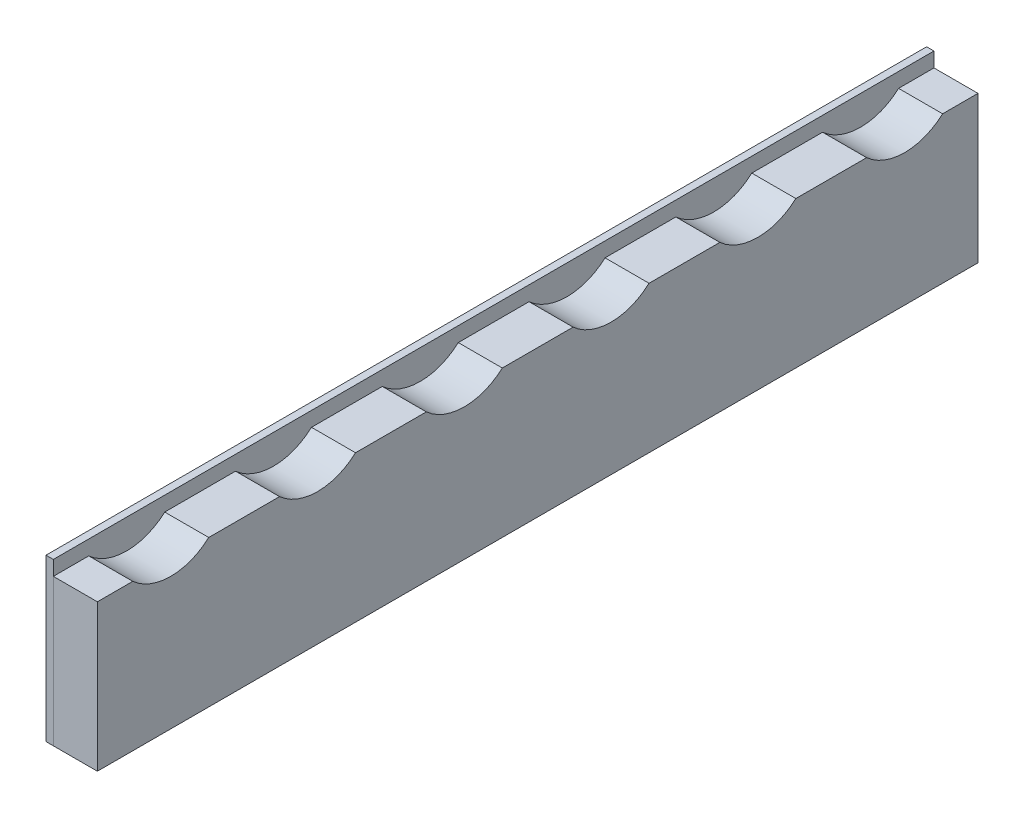
ISO-10303-21;
HEADER;
FILE_DESCRIPTION(('STEP AP214'),'2;1');
FILE_NAME('part.step','',(''),(''),'','','');
FILE_SCHEMA(('AUTOMOTIVE_DESIGN { 1 0 10303 214 1 1 1 1 }'));
ENDSEC;
DATA;
#1=APPLICATION_CONTEXT('core data for automotive mechanical design processes');
#2=APPLICATION_PROTOCOL_DEFINITION('international standard','automotive_design',2000,#1);
#3=PRODUCT_CONTEXT('',#1,'mechanical');
#4=PRODUCT('Part','Part','',(#3));
#5=PRODUCT_RELATED_PRODUCT_CATEGORY('part','',(#4));
#6=PRODUCT_DEFINITION_FORMATION('','',#4);
#7=PRODUCT_DEFINITION_CONTEXT('part definition',#1,'design');
#8=PRODUCT_DEFINITION('design','',#6,#7);
#9=PRODUCT_DEFINITION_SHAPE('','',#8);
#10=(LENGTH_UNIT() NAMED_UNIT(*) SI_UNIT(.MILLI.,.METRE.));
#11=(NAMED_UNIT(*) PLANE_ANGLE_UNIT() SI_UNIT($,.RADIAN.));
#12=(NAMED_UNIT(*) SI_UNIT($,.STERADIAN.) SOLID_ANGLE_UNIT());
#13=UNCERTAINTY_MEASURE_WITH_UNIT(LENGTH_MEASURE(1.E-05),#10,'distance_accuracy_value','');
#14=(GEOMETRIC_REPRESENTATION_CONTEXT(3) GLOBAL_UNCERTAINTY_ASSIGNED_CONTEXT((#13)) GLOBAL_UNIT_ASSIGNED_CONTEXT((#10,
#11,#12)) REPRESENTATION_CONTEXT('',''));
#15=CARTESIAN_POINT('',(0.,0.,0.));
#16=DIRECTION('',(0.,0.,1.));
#17=DIRECTION('',(1.,0.,0.));
#18=AXIS2_PLACEMENT_3D('',#15,#16,#17);
#19=CARTESIAN_POINT('',(-8.01,100.01,0.));
#20=DIRECTION('',(0.,0.,1.));
#21=DIRECTION('',(0.,-1.,0.));
#22=AXIS2_PLACEMENT_3D('',#19,#20,#21);
#23=PLANE('',#22);
#24=DIRECTION('',(1.,0.,0.));
#25=VECTOR('',#24,1.);
#26=CARTESIAN_POINT('',(7.,100.,0.));
#27=LINE('',#26,#25);
#28=CARTESIAN_POINT('',(-8.,100.,0.));
#29=VERTEX_POINT('',#28);
#30=CARTESIAN_POINT('',(22.,100.,0.));
#31=VERTEX_POINT('',#30);
#32=EDGE_CURVE('P0_E94',#29,#31,#27,.T.);
#33=ORIENTED_EDGE('',*,*,#32,.F.);
#34=DIRECTION('',(0.,1.,0.));
#35=VECTOR('',#34,1.);
#36=CARTESIAN_POINT('',(-8.,50.,0.));
#37=LINE('',#36,#35);
#38=CARTESIAN_POINT('',(-8.,0.,0.));
#39=VERTEX_POINT('',#38);
#40=EDGE_CURVE('P0_E196',#39,#29,#37,.T.);
#41=ORIENTED_EDGE('',*,*,#40,.F.);
#42=DIRECTION('',(-1.,0.,0.));
#43=VECTOR('',#42,1.);
#44=CARTESIAN_POINT('',(7.,0.,0.));
#45=LINE('',#44,#43);
#46=CARTESIAN_POINT('',(22.,0.,0.));
#47=VERTEX_POINT('',#46);
#48=EDGE_CURVE('P0_E229',#47,#39,#45,.T.);
#49=ORIENTED_EDGE('',*,*,#48,.F.);
#50=DIRECTION('',(0.,-1.,0.));
#51=VECTOR('',#50,1.);
#52=CARTESIAN_POINT('',(22.,50.,0.));
#53=LINE('',#52,#51);
#54=EDGE_CURVE('P0_E210',#31,#47,#53,.T.);
#55=ORIENTED_EDGE('',*,*,#54,.F.);
#56=EDGE_LOOP('',(#33,#41,#49,#55));
#57=FACE_BOUND('',#56,.T.);
#58=ADVANCED_FACE('P0_F17',(#57),#23,.T.);
#59=CARTESIAN_POINT('',(-8.01,0.,0.0100000000000711));
#60=DIRECTION('',(0.,-1.,0.));
#61=DIRECTION('',(0.,0.,-1.));
#62=AXIS2_PLACEMENT_3D('',#59,#60,#61);
#63=PLANE('',#62);
#64=DIRECTION('',(0.,0.,1.));
#65=VECTOR('',#64,1.);
#66=CARTESIAN_POINT('',(-8.,0.,-300.));
#67=LINE('',#66,#65);
#68=CARTESIAN_POINT('',(-8.,0.,-600.));
#69=VERTEX_POINT('',#68);
#70=EDGE_CURVE('P0_E169',#69,#39,#67,.T.);
#71=ORIENTED_EDGE('',*,*,#70,.F.);
#72=DIRECTION('',(-1.,0.,0.));
#73=VECTOR('',#72,1.);
#74=CARTESIAN_POINT('',(7.,0.,-600.));
#75=LINE('',#74,#73);
#76=CARTESIAN_POINT('',(22.,0.,-600.));
#77=VERTEX_POINT('',#76);
#78=EDGE_CURVE('P0_E205',#77,#69,#75,.T.);
#79=ORIENTED_EDGE('',*,*,#78,.F.);
#80=DIRECTION('',(0.,0.,-1.));
#81=VECTOR('',#80,1.);
#82=CARTESIAN_POINT('',(22.,0.,-300.));
#83=LINE('',#82,#81);
#84=EDGE_CURVE('P0_E213',#47,#77,#83,.T.);
#85=ORIENTED_EDGE('',*,*,#84,.F.);
#86=ORIENTED_EDGE('',*,*,#48,.T.);
#87=EDGE_LOOP('',(#71,#79,#85,#86));
#88=FACE_BOUND('',#87,.T.);
#89=ADVANCED_FACE('P0_F313',(#88),#63,.T.);
#90=CARTESIAN_POINT('',(-8.01,100.,-524.12564178891));
#91=DIRECTION('',(0.,1.,0.));
#92=DIRECTION('',(0.,0.,1.));
#93=AXIS2_PLACEMENT_3D('',#90,#91,#92);
#94=PLANE('',#93);
#95=DIRECTION('',(-1.,0.,0.));
#96=VECTOR('',#95,1.);
#97=CARTESIAN_POINT('',(7.,100.,-475.88435821109));
#98=LINE('',#97,#96);
#99=CARTESIAN_POINT('',(22.,100.,-475.88435821109));
#100=VERTEX_POINT('',#99);
#101=CARTESIAN_POINT('',(-8.,100.,-475.88435821109));
#102=VERTEX_POINT('',#101);
#103=EDGE_CURVE('P0_E129',#100,#102,#98,.T.);
#104=ORIENTED_EDGE('',*,*,#103,.F.);
#105=DIRECTION('',(0.,0.,1.));
#106=VECTOR('',#105,1.);
#107=CARTESIAN_POINT('',(22.,100.,-300.));
#108=LINE('',#107,#106);
#109=CARTESIAN_POINT('',(22.,100.,-524.11564178891));
#110=VERTEX_POINT('',#109);
#111=EDGE_CURVE('P0_E157',#110,#100,#108,.T.);
#112=ORIENTED_EDGE('',*,*,#111,.F.);
#113=DIRECTION('',(1.,0.,0.));
#114=VECTOR('',#113,1.);
#115=CARTESIAN_POINT('',(7.,100.,-524.11564178891));
#116=LINE('',#115,#114);
#117=CARTESIAN_POINT('',(-8.,100.,-524.11564178891));
#118=VERTEX_POINT('',#117);
#119=EDGE_CURVE('P0_E168',#118,#110,#116,.T.);
#120=ORIENTED_EDGE('',*,*,#119,.F.);
#121=DIRECTION('',(0.,0.,-1.));
#122=VECTOR('',#121,1.);
#123=CARTESIAN_POINT('',(-8.,100.,-300.));
#124=LINE('',#123,#122);
#125=EDGE_CURVE('P0_E171',#102,#118,#124,.T.);
#126=ORIENTED_EDGE('',*,*,#125,.F.);
#127=EDGE_LOOP('',(#104,#112,#120,#126));
#128=FACE_BOUND('',#127,.T.);
#129=ADVANCED_FACE('P0_F299',(#128),#94,.T.);
#130=CARTESIAN_POINT('',(22.,128.500000000001,-450.));
#131=DIRECTION('',(-1.,0.,0.));
#132=DIRECTION('',(0.,-1.,0.));
#133=AXIS2_PLACEMENT_3D('',#130,#131,#132);
#134=CYLINDRICAL_SURFACE('',#133,38.5000000000009);
#135=DIRECTION('',(-1.,0.,0.));
#136=VECTOR('',#135,1.);
#137=CARTESIAN_POINT('',(7.,100.,-424.11564178891));
#138=LINE('',#137,#136);
#139=CARTESIAN_POINT('',(22.,100.,-424.11564178891));
#140=VERTEX_POINT('',#139);
#141=CARTESIAN_POINT('',(-8.,100.,-424.11564178891));
#142=VERTEX_POINT('',#141);
#143=EDGE_CURVE('P0_E134',#140,#142,#138,.T.);
#144=ORIENTED_EDGE('',*,*,#143,.F.);
#145=CARTESIAN_POINT('',(22.,128.500000000001,-450.));
#146=DIRECTION('',(-1.,0.,0.));
#147=DIRECTION('',(0.,-1.,0.));
#148=AXIS2_PLACEMENT_3D('',#145,#146,#147);
#149=CIRCLE('',#148,38.5000000000009);
#150=EDGE_CURVE('P0_E138',#100,#140,#149,.T.);
#151=ORIENTED_EDGE('',*,*,#150,.F.);
#152=ORIENTED_EDGE('',*,*,#103,.T.);
#153=CARTESIAN_POINT('',(-8.,128.500000000001,-450.));
#154=DIRECTION('',(-1.,0.,0.));
#155=DIRECTION('',(0.,-1.,0.));
#156=AXIS2_PLACEMENT_3D('',#153,#154,#155);
#157=CIRCLE('',#156,38.5000000000009);
#158=EDGE_CURVE('P0_E141',#142,#102,#157,.F.);
#159=ORIENTED_EDGE('',*,*,#158,.F.);
#160=EDGE_LOOP('',(#144,#151,#152,#159));
#161=FACE_BOUND('',#160,.T.);
#162=ADVANCED_FACE('P0_F136',(#161),#134,.F.);
#163=CARTESIAN_POINT('',(-8.01,100.,-424.12564178891));
#164=DIRECTION('',(0.,1.,0.));
#165=DIRECTION('',(0.,0.,1.));
#166=AXIS2_PLACEMENT_3D('',#163,#164,#165);
#167=PLANE('',#166);
#168=DIRECTION('',(-1.,0.,0.));
#169=VECTOR('',#168,1.);
#170=CARTESIAN_POINT('',(7.,100.,-375.88435821109));
#171=LINE('',#170,#169);
#172=CARTESIAN_POINT('',(22.,100.,-375.88435821109));
#173=VERTEX_POINT('',#172);
#174=CARTESIAN_POINT('',(-8.,100.,-375.88435821109));
#175=VERTEX_POINT('',#174);
#176=EDGE_CURVE('P0_E145',#173,#175,#171,.T.);
#177=ORIENTED_EDGE('',*,*,#176,.F.);
#178=DIRECTION('',(0.,0.,1.));
#179=VECTOR('',#178,1.);
#180=CARTESIAN_POINT('',(22.,100.,-300.));
#181=LINE('',#180,#179);
#182=EDGE_CURVE('P0_E148',#140,#173,#181,.T.);
#183=ORIENTED_EDGE('',*,*,#182,.F.);
#184=ORIENTED_EDGE('',*,*,#143,.T.);
#185=DIRECTION('',(0.,0.,-1.));
#186=VECTOR('',#185,1.);
#187=CARTESIAN_POINT('',(-8.,100.,-300.));
#188=LINE('',#187,#186);
#189=EDGE_CURVE('P0_E172',#175,#142,#188,.T.);
#190=ORIENTED_EDGE('',*,*,#189,.F.);
#191=EDGE_LOOP('',(#177,#183,#184,#190));
#192=FACE_BOUND('',#191,.T.);
#193=ADVANCED_FACE('P0_F149',(#192),#167,.T.);
#194=CARTESIAN_POINT('',(22.,128.500000000001,-350.));
#195=DIRECTION('',(-1.,0.,0.));
#196=DIRECTION('',(0.,-1.,0.));
#197=AXIS2_PLACEMENT_3D('',#194,#195,#196);
#198=CYLINDRICAL_SURFACE('',#197,38.5000000000009);
#199=DIRECTION('',(-1.,0.,0.));
#200=VECTOR('',#199,1.);
#201=CARTESIAN_POINT('',(7.,100.,-324.11564178891));
#202=LINE('',#201,#200);
#203=CARTESIAN_POINT('',(22.,100.,-324.11564178891));
#204=VERTEX_POINT('',#203);
#205=CARTESIAN_POINT('',(-8.,100.,-324.11564178891));
#206=VERTEX_POINT('',#205);
#207=EDGE_CURVE('P0_E225',#204,#206,#202,.T.);
#208=ORIENTED_EDGE('',*,*,#207,.F.);
#209=CARTESIAN_POINT('',(22.,128.500000000001,-350.));
#210=DIRECTION('',(-1.,0.,0.));
#211=DIRECTION('',(0.,-1.,0.));
#212=AXIS2_PLACEMENT_3D('',#209,#210,#211);
#213=CIRCLE('',#212,38.5000000000009);
#214=EDGE_CURVE('P0_E153',#173,#204,#213,.T.);
#215=ORIENTED_EDGE('',*,*,#214,.F.);
#216=ORIENTED_EDGE('',*,*,#176,.T.);
#217=CARTESIAN_POINT('',(-8.,128.500000000001,-350.));
#218=DIRECTION('',(-1.,0.,0.));
#219=DIRECTION('',(0.,-1.,0.));
#220=AXIS2_PLACEMENT_3D('',#217,#218,#219);
#221=CIRCLE('',#220,38.5000000000009);
#222=EDGE_CURVE('P0_E173',#206,#175,#221,.F.);
#223=ORIENTED_EDGE('',*,*,#222,.F.);
#224=EDGE_LOOP('',(#208,#215,#216,#223));
#225=FACE_BOUND('',#224,.T.);
#226=ADVANCED_FACE('P0_F296',(#225),#198,.F.);
#227=CARTESIAN_POINT('',(-8.01,100.,-324.12564178891));
#228=DIRECTION('',(0.,1.,0.));
#229=DIRECTION('',(0.,0.,1.));
#230=AXIS2_PLACEMENT_3D('',#227,#228,#229);
#231=PLANE('',#230);
#232=ORIENTED_EDGE('',*,*,#207,.T.);
#233=DIRECTION('',(0.,0.,-1.));
#234=VECTOR('',#233,1.);
#235=CARTESIAN_POINT('',(-8.,100.,-300.));
#236=LINE('',#235,#234);
#237=CARTESIAN_POINT('',(-8.,100.,-275.88435821109));
#238=VERTEX_POINT('',#237);
#239=EDGE_CURVE('P0_E176',#238,#206,#236,.T.);
#240=ORIENTED_EDGE('',*,*,#239,.F.);
#241=DIRECTION('',(-1.,0.,0.));
#242=VECTOR('',#241,1.);
#243=CARTESIAN_POINT('',(7.,100.,-275.88435821109));
#244=LINE('',#243,#242);
#245=CARTESIAN_POINT('',(22.,100.,-275.88435821109));
#246=VERTEX_POINT('',#245);
#247=EDGE_CURVE('P0_E223',#246,#238,#244,.T.);
#248=ORIENTED_EDGE('',*,*,#247,.F.);
#249=DIRECTION('',(0.,0.,1.));
#250=VECTOR('',#249,1.);
#251=CARTESIAN_POINT('',(22.,100.,-300.));
#252=LINE('',#251,#250);
#253=EDGE_CURVE('P0_E260',#204,#246,#252,.T.);
#254=ORIENTED_EDGE('',*,*,#253,.F.);
#255=EDGE_LOOP('',(#232,#240,#248,#254));
#256=FACE_BOUND('',#255,.T.);
#257=ADVANCED_FACE('P0_F294',(#256),#231,.T.);
#258=CARTESIAN_POINT('',(-8.,128.500000000001,-250.));
#259=DIRECTION('',(1.,0.,0.));
#260=DIRECTION('',(0.,0.,-1.));
#261=AXIS2_PLACEMENT_3D('',#258,#259,#260);
#262=CYLINDRICAL_SURFACE('',#261,38.5000000000009);
#263=ORIENTED_EDGE('',*,*,#247,.T.);
#264=CARTESIAN_POINT('',(-8.,128.500000000001,-250.));
#265=DIRECTION('',(1.,0.,0.));
#266=DIRECTION('',(0.,0.,-1.));
#267=AXIS2_PLACEMENT_3D('',#264,#265,#266);
#268=CIRCLE('',#267,38.5000000000009);
#269=CARTESIAN_POINT('',(-8.,100.,-224.11564178891));
#270=VERTEX_POINT('',#269);
#271=EDGE_CURVE('P0_E177',#270,#238,#268,.T.);
#272=ORIENTED_EDGE('',*,*,#271,.F.);
#273=DIRECTION('',(-1.,0.,0.));
#274=VECTOR('',#273,1.);
#275=CARTESIAN_POINT('',(7.,100.,-224.11564178891));
#276=LINE('',#275,#274);
#277=CARTESIAN_POINT('',(22.,100.,-224.11564178891));
#278=VERTEX_POINT('',#277);
#279=EDGE_CURVE('P0_E221',#278,#270,#276,.T.);
#280=ORIENTED_EDGE('',*,*,#279,.F.);
#281=CARTESIAN_POINT('',(22.,128.500000000001,-250.));
#282=DIRECTION('',(1.,0.,0.));
#283=DIRECTION('',(0.,0.,-1.));
#284=AXIS2_PLACEMENT_3D('',#281,#282,#283);
#285=CIRCLE('',#284,38.5000000000009);
#286=EDGE_CURVE('P0_E258',#246,#278,#285,.F.);
#287=ORIENTED_EDGE('',*,*,#286,.F.);
#288=EDGE_LOOP('',(#263,#272,#280,#287));
#289=FACE_BOUND('',#288,.T.);
#290=ADVANCED_FACE('P0_F332',(#289),#262,.F.);
#291=CARTESIAN_POINT('',(-8.01,100.,-224.12564178891));
#292=DIRECTION('',(0.,1.,0.));
#293=DIRECTION('',(0.,0.,1.));
#294=AXIS2_PLACEMENT_3D('',#291,#292,#293);
#295=PLANE('',#294);
#296=ORIENTED_EDGE('',*,*,#279,.T.);
#297=DIRECTION('',(0.,0.,-1.));
#298=VECTOR('',#297,1.);
#299=CARTESIAN_POINT('',(-8.,100.,-300.));
#300=LINE('',#299,#298);
#301=CARTESIAN_POINT('',(-8.,100.,-175.88435821109));
#302=VERTEX_POINT('',#301);
#303=EDGE_CURVE('P0_E179',#302,#270,#300,.T.);
#304=ORIENTED_EDGE('',*,*,#303,.F.);
#305=DIRECTION('',(-1.,0.,0.));
#306=VECTOR('',#305,1.);
#307=CARTESIAN_POINT('',(7.,100.,-175.88435821109));
#308=LINE('',#307,#306);
#309=CARTESIAN_POINT('',(22.,100.,-175.88435821109));
#310=VERTEX_POINT('',#309);
#311=EDGE_CURVE('P0_E219',#310,#302,#308,.T.);
#312=ORIENTED_EDGE('',*,*,#311,.F.);
#313=DIRECTION('',(0.,0.,1.));
#314=VECTOR('',#313,1.);
#315=CARTESIAN_POINT('',(22.,100.,-300.));
#316=LINE('',#315,#314);
#317=EDGE_CURVE('P0_E257',#278,#310,#316,.T.);
#318=ORIENTED_EDGE('',*,*,#317,.F.);
#319=EDGE_LOOP('',(#296,#304,#312,#318));
#320=FACE_BOUND('',#319,.T.);
#321=ADVANCED_FACE('P0_F330',(#320),#295,.T.);
#322=CARTESIAN_POINT('',(-8.,128.500000000001,-150.));
#323=DIRECTION('',(1.,0.,0.));
#324=DIRECTION('',(0.,0.,-1.));
#325=AXIS2_PLACEMENT_3D('',#322,#323,#324);
#326=CYLINDRICAL_SURFACE('',#325,38.500000000001);
#327=ORIENTED_EDGE('',*,*,#311,.T.);
#328=CARTESIAN_POINT('',(-8.,128.500000000001,-150.));
#329=DIRECTION('',(1.,0.,0.));
#330=DIRECTION('',(0.,0.,-1.));
#331=AXIS2_PLACEMENT_3D('',#328,#329,#330);
#332=CIRCLE('',#331,38.500000000001);
#333=CARTESIAN_POINT('',(-8.,100.,-124.11564178891));
#334=VERTEX_POINT('',#333);
#335=EDGE_CURVE('P0_E180',#334,#302,#332,.T.);
#336=ORIENTED_EDGE('',*,*,#335,.F.);
#337=DIRECTION('',(-1.,0.,0.));
#338=VECTOR('',#337,1.);
#339=CARTESIAN_POINT('',(7.,100.,-124.11564178891));
#340=LINE('',#339,#338);
#341=CARTESIAN_POINT('',(22.,100.,-124.11564178891));
#342=VERTEX_POINT('',#341);
#343=EDGE_CURVE('P0_E217',#342,#334,#340,.T.);
#344=ORIENTED_EDGE('',*,*,#343,.F.);
#345=CARTESIAN_POINT('',(22.,128.500000000001,-150.));
#346=DIRECTION('',(1.,0.,0.));
#347=DIRECTION('',(0.,0.,-1.));
#348=AXIS2_PLACEMENT_3D('',#345,#346,#347);
#349=CIRCLE('',#348,38.500000000001);
#350=EDGE_CURVE('P0_E255',#310,#342,#349,.F.);
#351=ORIENTED_EDGE('',*,*,#350,.F.);
#352=EDGE_LOOP('',(#327,#336,#344,#351));
#353=FACE_BOUND('',#352,.T.);
#354=ADVANCED_FACE('P0_F326',(#353),#326,.F.);
#355=CARTESIAN_POINT('',(-8.01,100.,-124.12564178891));
#356=DIRECTION('',(0.,1.,0.));
#357=DIRECTION('',(0.,0.,1.));
#358=AXIS2_PLACEMENT_3D('',#355,#356,#357);
#359=PLANE('',#358);
#360=ORIENTED_EDGE('',*,*,#343,.T.);
#361=DIRECTION('',(0.,0.,-1.));
#362=VECTOR('',#361,1.);
#363=CARTESIAN_POINT('',(-8.,100.,-300.));
#364=LINE('',#363,#362);
#365=CARTESIAN_POINT('',(-8.,100.,-75.8843582110896));
#366=VERTEX_POINT('',#365);
#367=EDGE_CURVE('P0_E182',#366,#334,#364,.T.);
#368=ORIENTED_EDGE('',*,*,#367,.F.);
#369=DIRECTION('',(-1.,0.,0.));
#370=VECTOR('',#369,1.);
#371=CARTESIAN_POINT('',(7.,100.,-75.8843582110896));
#372=LINE('',#371,#370);
#373=CARTESIAN_POINT('',(22.,100.,-75.8843582110896));
#374=VERTEX_POINT('',#373);
#375=EDGE_CURVE('P0_E207',#374,#366,#372,.T.);
#376=ORIENTED_EDGE('',*,*,#375,.F.);
#377=DIRECTION('',(0.,0.,1.));
#378=VECTOR('',#377,1.);
#379=CARTESIAN_POINT('',(22.,100.,-300.));
#380=LINE('',#379,#378);
#381=EDGE_CURVE('P0_E254',#342,#374,#380,.T.);
#382=ORIENTED_EDGE('',*,*,#381,.F.);
#383=EDGE_LOOP('',(#360,#368,#376,#382));
#384=FACE_BOUND('',#383,.T.);
#385=ADVANCED_FACE('P0_F323',(#384),#359,.T.);
#386=CARTESIAN_POINT('',(-8.,128.5,-50.));
#387=DIRECTION('',(1.,0.,0.));
#388=DIRECTION('',(0.,0.,-1.));
#389=AXIS2_PLACEMENT_3D('',#386,#387,#388);
#390=CYLINDRICAL_SURFACE('',#389,38.5000000000001);
#391=ORIENTED_EDGE('',*,*,#375,.T.);
#392=CARTESIAN_POINT('',(-8.,128.5,-50.));
#393=DIRECTION('',(1.,0.,0.));
#394=DIRECTION('',(0.,0.,-1.));
#395=AXIS2_PLACEMENT_3D('',#392,#393,#394);
#396=CIRCLE('',#395,38.5000000000001);
#397=CARTESIAN_POINT('',(-8.,100.,-24.1156417889104));
#398=VERTEX_POINT('',#397);
#399=EDGE_CURVE('P0_E21',#398,#366,#396,.T.);
#400=ORIENTED_EDGE('',*,*,#399,.F.);
#401=DIRECTION('',(-1.,0.,0.));
#402=VECTOR('',#401,1.);
#403=CARTESIAN_POINT('',(7.,100.,-24.1156417889104));
#404=LINE('',#403,#402);
#405=CARTESIAN_POINT('',(22.,100.,-24.1156417889104));
#406=VERTEX_POINT('',#405);
#407=EDGE_CURVE('P0_E84',#406,#398,#404,.T.);
#408=ORIENTED_EDGE('',*,*,#407,.F.);
#409=CARTESIAN_POINT('',(22.,128.5,-50.));
#410=DIRECTION('',(1.,0.,0.));
#411=DIRECTION('',(0.,0.,-1.));
#412=AXIS2_PLACEMENT_3D('',#409,#410,#411);
#413=CIRCLE('',#412,38.5000000000001);
#414=EDGE_CURVE('P0_E251',#374,#406,#413,.F.);
#415=ORIENTED_EDGE('',*,*,#414,.F.);
#416=EDGE_LOOP('',(#391,#400,#408,#415));
#417=FACE_BOUND('',#416,.T.);
#418=ADVANCED_FACE('P0_F318',(#417),#390,.F.);
#419=CARTESIAN_POINT('',(-8.01,100.,-24.1256417889104));
#420=DIRECTION('',(0.,1.,0.));
#421=DIRECTION('',(0.,0.,1.));
#422=AXIS2_PLACEMENT_3D('',#419,#420,#421);
#423=PLANE('',#422);
#424=ORIENTED_EDGE('',*,*,#407,.T.);
#425=DIRECTION('',(0.,0.,-1.));
#426=VECTOR('',#425,1.);
#427=CARTESIAN_POINT('',(-8.,100.,-300.));
#428=LINE('',#427,#426);
#429=EDGE_CURVE('P0_E191',#29,#398,#428,.T.);
#430=ORIENTED_EDGE('',*,*,#429,.F.);
#431=ORIENTED_EDGE('',*,*,#32,.T.);
#432=DIRECTION('',(0.,0.,1.));
#433=VECTOR('',#432,1.);
#434=CARTESIAN_POINT('',(22.,100.,-300.));
#435=LINE('',#434,#433);
#436=EDGE_CURVE('P0_E253',#406,#31,#435,.T.);
#437=ORIENTED_EDGE('',*,*,#436,.F.);
#438=EDGE_LOOP('',(#424,#430,#431,#437));
#439=FACE_BOUND('',#438,.T.);
#440=ADVANCED_FACE('P0_F316',(#439),#423,.T.);
#441=CARTESIAN_POINT('',(-8.01,-0.00999999999999446,-600.));
#442=DIRECTION('',(0.,0.,-1.));
#443=DIRECTION('',(0.,1.,0.));
#444=AXIS2_PLACEMENT_3D('',#441,#442,#443);
#445=PLANE('',#444);
#446=DIRECTION('',(-1.,0.,0.));
#447=VECTOR('',#446,1.);
#448=CARTESIAN_POINT('',(7.,100.,-600.));
#449=LINE('',#448,#447);
#450=CARTESIAN_POINT('',(22.,100.,-600.));
#451=VERTEX_POINT('',#450);
#452=CARTESIAN_POINT('',(-8.,100.,-600.));
#453=VERTEX_POINT('',#452);
#454=EDGE_CURVE('P0_E278',#451,#453,#449,.T.);
#455=ORIENTED_EDGE('',*,*,#454,.F.);
#456=DIRECTION('',(0.,1.,0.));
#457=VECTOR('',#456,1.);
#458=CARTESIAN_POINT('',(22.,50.,-600.));
#459=LINE('',#458,#457);
#460=EDGE_CURVE('P0_E164',#77,#451,#459,.T.);
#461=ORIENTED_EDGE('',*,*,#460,.F.);
#462=ORIENTED_EDGE('',*,*,#78,.T.);
#463=DIRECTION('',(0.,-1.,0.));
#464=VECTOR('',#463,1.);
#465=CARTESIAN_POINT('',(-8.,50.,-600.));
#466=LINE('',#465,#464);
#467=EDGE_CURVE('P0_E199',#453,#69,#466,.T.);
#468=ORIENTED_EDGE('',*,*,#467,.F.);
#469=EDGE_LOOP('',(#455,#461,#462,#468));
#470=FACE_BOUND('',#469,.T.);
#471=ADVANCED_FACE('P0_F314',(#470),#445,.T.);
#472=CARTESIAN_POINT('',(-8.,-0.0100000000000033,-600.01));
#473=DIRECTION('',(-1.,0.,0.));
#474=DIRECTION('',(0.,0.,1.));
#475=AXIS2_PLACEMENT_3D('',#472,#473,#474);
#476=PLANE('',#475);
#477=ORIENTED_EDGE('',*,*,#467,.T.);
#478=ORIENTED_EDGE('',*,*,#70,.T.);
#479=ORIENTED_EDGE('',*,*,#40,.T.);
#480=ORIENTED_EDGE('',*,*,#429,.T.);
#481=ORIENTED_EDGE('',*,*,#399,.T.);
#482=ORIENTED_EDGE('',*,*,#367,.T.);
#483=ORIENTED_EDGE('',*,*,#335,.T.);
#484=ORIENTED_EDGE('',*,*,#303,.T.);
#485=ORIENTED_EDGE('',*,*,#271,.T.);
#486=ORIENTED_EDGE('',*,*,#239,.T.);
#487=ORIENTED_EDGE('',*,*,#222,.T.);
#488=ORIENTED_EDGE('',*,*,#189,.T.);
#489=ORIENTED_EDGE('',*,*,#158,.T.);
#490=ORIENTED_EDGE('',*,*,#125,.T.);
#491=CARTESIAN_POINT('',(-8.,128.500000000001,-550.));
#492=DIRECTION('',(-1.,0.,0.));
#493=DIRECTION('',(0.,-1.,0.));
#494=AXIS2_PLACEMENT_3D('',#491,#492,#493);
#495=CIRCLE('',#494,38.5000000000012);
#496=CARTESIAN_POINT('',(-8.,100.,-575.88435821109));
#497=VERTEX_POINT('',#496);
#498=EDGE_CURVE('P0_E165',#497,#118,#495,.T.);
#499=ORIENTED_EDGE('',*,*,#498,.F.);
#500=DIRECTION('',(0.,0.,1.));
#501=VECTOR('',#500,1.);
#502=CARTESIAN_POINT('',(-8.,100.,-587.942179105545));
#503=LINE('',#502,#501);
#504=EDGE_CURVE('P0_E270',#453,#497,#503,.T.);
#505=ORIENTED_EDGE('',*,*,#504,.F.);
#506=EDGE_LOOP('',(#477,#478,#479,#480,#481,#482,#483,#484,#485,#486,#487,#488,#489,#490,#499,#505));
#507=FACE_BOUND('',#506,.T.);
#508=ADVANCED_FACE('P0_F290',(#507),#476,.T.);
#509=CARTESIAN_POINT('',(22.,128.500000000001,-550.));
#510=DIRECTION('',(-1.,0.,0.));
#511=DIRECTION('',(0.,-1.,0.));
#512=AXIS2_PLACEMENT_3D('',#509,#510,#511);
#513=CYLINDRICAL_SURFACE('',#512,38.5000000000012);
#514=ORIENTED_EDGE('',*,*,#119,.T.);
#515=CARTESIAN_POINT('',(22.,128.500000000001,-550.));
#516=DIRECTION('',(-1.,0.,0.));
#517=DIRECTION('',(0.,-1.,0.));
#518=AXIS2_PLACEMENT_3D('',#515,#516,#517);
#519=CIRCLE('',#518,38.5000000000012);
#520=CARTESIAN_POINT('',(22.,100.,-575.88435821109));
#521=VERTEX_POINT('',#520);
#522=EDGE_CURVE('P0_E36',#521,#110,#519,.T.);
#523=ORIENTED_EDGE('',*,*,#522,.F.);
#524=DIRECTION('',(1.,0.,0.));
#525=VECTOR('',#524,1.);
#526=CARTESIAN_POINT('',(7.,100.,-575.88435821109));
#527=LINE('',#526,#525);
#528=EDGE_CURVE('P0_E27',#497,#521,#527,.T.);
#529=ORIENTED_EDGE('',*,*,#528,.F.);
#530=ORIENTED_EDGE('',*,*,#498,.T.);
#531=EDGE_LOOP('',(#514,#523,#529,#530));
#532=FACE_BOUND('',#531,.T.);
#533=ADVANCED_FACE('P0_F300',(#532),#513,.F.);
#534=CARTESIAN_POINT('',(22.,-0.0100000000000033,0.00999999999999446));
#535=DIRECTION('',(1.,0.,0.));
#536=DIRECTION('',(0.,0.,-1.));
#537=AXIS2_PLACEMENT_3D('',#534,#535,#536);
#538=PLANE('',#537);
#539=ORIENTED_EDGE('',*,*,#414,.T.);
#540=ORIENTED_EDGE('',*,*,#436,.T.);
#541=ORIENTED_EDGE('',*,*,#54,.T.);
#542=ORIENTED_EDGE('',*,*,#84,.T.);
#543=ORIENTED_EDGE('',*,*,#460,.T.);
#544=DIRECTION('',(0.,0.,-1.));
#545=VECTOR('',#544,1.);
#546=CARTESIAN_POINT('',(22.,100.,-587.942179105545));
#547=LINE('',#546,#545);
#548=EDGE_CURVE('P0_E11',#521,#451,#547,.T.);
#549=ORIENTED_EDGE('',*,*,#548,.F.);
#550=ORIENTED_EDGE('',*,*,#522,.T.);
#551=ORIENTED_EDGE('',*,*,#111,.T.);
#552=ORIENTED_EDGE('',*,*,#150,.T.);
#553=ORIENTED_EDGE('',*,*,#182,.T.);
#554=ORIENTED_EDGE('',*,*,#214,.T.);
#555=ORIENTED_EDGE('',*,*,#253,.T.);
#556=ORIENTED_EDGE('',*,*,#286,.T.);
#557=ORIENTED_EDGE('',*,*,#317,.T.);
#558=ORIENTED_EDGE('',*,*,#350,.T.);
#559=ORIENTED_EDGE('',*,*,#381,.T.);
#560=EDGE_LOOP('',(#539,#540,#541,#542,#543,#549,#550,#551,#552,#553,#554,#555,#556,#557,#558,#559));
#561=FACE_BOUND('',#560,.T.);
#562=ADVANCED_FACE('P0_F156',(#561),#538,.T.);
#563=CARTESIAN_POINT('',(-8.01,100.,-600.01));
#564=DIRECTION('',(0.,1.,0.));
#565=DIRECTION('',(0.,0.,1.));
#566=AXIS2_PLACEMENT_3D('',#563,#564,#565);
#567=PLANE('',#566);
#568=ORIENTED_EDGE('',*,*,#528,.T.);
#569=ORIENTED_EDGE('',*,*,#548,.T.);
#570=ORIENTED_EDGE('',*,*,#454,.T.);
#571=ORIENTED_EDGE('',*,*,#504,.T.);
#572=EDGE_LOOP('',(#568,#569,#570,#571));
#573=FACE_BOUND('',#572,.T.);
#574=ADVANCED_FACE('P0_F19',(#573),#567,.T.);
#575=CLOSED_SHELL('',(#58,#89,#129,#162,#193,#226,#257,#290,#321,#354,#385,#418,#440,#471,#508,
#533,#562,#574));
#576=MANIFOLD_SOLID_BREP('P0_B1',#575);
#577=CARTESIAN_POINT('',(-7.99,-0.01,0.));
#578=DIRECTION('',(0.,0.,1.));
#579=DIRECTION('',(0.,1.,0.));
#580=AXIS2_PLACEMENT_3D('',#577,#578,#579);
#581=PLANE('',#580);
#582=DIRECTION('',(0.,1.,0.));
#583=VECTOR('',#582,1.);
#584=CARTESIAN_POINT('',(-13.,55.,0.));
#585=LINE('',#584,#583);
#586=CARTESIAN_POINT('',(-13.,0.,0.));
#587=VERTEX_POINT('',#586);
#588=CARTESIAN_POINT('',(-13.,110.,0.));
#589=VERTEX_POINT('',#588);
#590=EDGE_CURVE('P1_E56',#587,#589,#585,.T.);
#591=ORIENTED_EDGE('',*,*,#590,.F.);
#592=DIRECTION('',(-1.,0.,0.));
#593=VECTOR('',#592,1.);
#594=CARTESIAN_POINT('',(-10.5,0.,0.));
#595=LINE('',#594,#593);
#596=CARTESIAN_POINT('',(-8.,0.,0.));
#597=VERTEX_POINT('',#596);
#598=EDGE_CURVE('P1_E68',#597,#587,#595,.T.);
#599=ORIENTED_EDGE('',*,*,#598,.F.);
#600=DIRECTION('',(0.,-1.,0.));
#601=VECTOR('',#600,1.);
#602=CARTESIAN_POINT('',(-8.,55.,0.));
#603=LINE('',#602,#601);
#604=CARTESIAN_POINT('',(-8.,110.,0.));
#605=VERTEX_POINT('',#604);
#606=EDGE_CURVE('P1_E21',#605,#597,#603,.T.);
#607=ORIENTED_EDGE('',*,*,#606,.F.);
#608=DIRECTION('',(1.,0.,0.));
#609=VECTOR('',#608,1.);
#610=CARTESIAN_POINT('',(-10.5,110.,0.));
#611=LINE('',#610,#609);
#612=EDGE_CURVE('P1_E82',#589,#605,#611,.T.);
#613=ORIENTED_EDGE('',*,*,#612,.F.);
#614=EDGE_LOOP('',(#591,#599,#607,#613));
#615=FACE_BOUND('',#614,.T.);
#616=ADVANCED_FACE('P1_F17',(#615),#581,.T.);
#617=CARTESIAN_POINT('',(-8.,-0.0100000000000033,0.00999999999999446));
#618=DIRECTION('',(1.,0.,0.));
#619=DIRECTION('',(0.,0.,-1.));
#620=AXIS2_PLACEMENT_3D('',#617,#618,#619);
#621=PLANE('',#620);
#622=DIRECTION('',(0.,-1.,0.));
#623=VECTOR('',#622,1.);
#624=CARTESIAN_POINT('',(-8.,55.,-600.));
#625=LINE('',#624,#623);
#626=CARTESIAN_POINT('',(-8.,110.,-600.));
#627=VERTEX_POINT('',#626);
#628=CARTESIAN_POINT('',(-8.,0.,-600.));
#629=VERTEX_POINT('',#628);
#630=EDGE_CURVE('P1_E84',#627,#629,#625,.T.);
#631=ORIENTED_EDGE('',*,*,#630,.F.);
#632=DIRECTION('',(0.,0.,-1.));
#633=VECTOR('',#632,1.);
#634=CARTESIAN_POINT('',(-8.,110.,-300.));
#635=LINE('',#634,#633);
#636=EDGE_CURVE('P1_E66',#605,#627,#635,.T.);
#637=ORIENTED_EDGE('',*,*,#636,.F.);
#638=ORIENTED_EDGE('',*,*,#606,.T.);
#639=DIRECTION('',(0.,0.,1.));
#640=VECTOR('',#639,1.);
#641=CARTESIAN_POINT('',(-8.,0.,-300.));
#642=LINE('',#641,#640);
#643=EDGE_CURVE('P1_E63',#629,#597,#642,.T.);
#644=ORIENTED_EDGE('',*,*,#643,.F.);
#645=EDGE_LOOP('',(#631,#637,#638,#644));
#646=FACE_BOUND('',#645,.T.);
#647=ADVANCED_FACE('P1_F61',(#646),#621,.T.);
#648=CARTESIAN_POINT('',(-7.99,0.,-600.01));
#649=DIRECTION('',(0.,-1.,0.));
#650=DIRECTION('',(0.,0.,1.));
#651=AXIS2_PLACEMENT_3D('',#648,#649,#650);
#652=PLANE('',#651);
#653=DIRECTION('',(0.,0.,1.));
#654=VECTOR('',#653,1.);
#655=CARTESIAN_POINT('',(-13.,0.,-300.));
#656=LINE('',#655,#654);
#657=CARTESIAN_POINT('',(-13.,0.,-600.));
#658=VERTEX_POINT('',#657);
#659=EDGE_CURVE('P1_E78',#658,#587,#656,.T.);
#660=ORIENTED_EDGE('',*,*,#659,.F.);
#661=DIRECTION('',(-1.,0.,0.));
#662=VECTOR('',#661,1.);
#663=CARTESIAN_POINT('',(-10.5,0.,-600.));
#664=LINE('',#663,#662);
#665=EDGE_CURVE('P1_E74',#629,#658,#664,.T.);
#666=ORIENTED_EDGE('',*,*,#665,.F.);
#667=ORIENTED_EDGE('',*,*,#643,.T.);
#668=ORIENTED_EDGE('',*,*,#598,.T.);
#669=EDGE_LOOP('',(#660,#666,#667,#668));
#670=FACE_BOUND('',#669,.T.);
#671=ADVANCED_FACE('P1_F72',(#670),#652,.T.);
#672=CARTESIAN_POINT('',(-13.,-0.0100000000000033,-600.01));
#673=DIRECTION('',(-1.,0.,0.));
#674=DIRECTION('',(0.,0.,1.));
#675=AXIS2_PLACEMENT_3D('',#672,#673,#674);
#676=PLANE('',#675);
#677=DIRECTION('',(0.,1.,0.));
#678=VECTOR('',#677,1.);
#679=CARTESIAN_POINT('',(-13.,55.,-600.));
#680=LINE('',#679,#678);
#681=CARTESIAN_POINT('',(-13.,110.,-600.));
#682=VERTEX_POINT('',#681);
#683=EDGE_CURVE('P1_E27',#658,#682,#680,.T.);
#684=ORIENTED_EDGE('',*,*,#683,.F.);
#685=ORIENTED_EDGE('',*,*,#659,.T.);
#686=ORIENTED_EDGE('',*,*,#590,.T.);
#687=DIRECTION('',(0.,0.,1.));
#688=VECTOR('',#687,1.);
#689=CARTESIAN_POINT('',(-13.,110.,-300.));
#690=LINE('',#689,#688);
#691=EDGE_CURVE('P1_E36',#682,#589,#690,.T.);
#692=ORIENTED_EDGE('',*,*,#691,.F.);
#693=EDGE_LOOP('',(#684,#685,#686,#692));
#694=FACE_BOUND('',#693,.T.);
#695=ADVANCED_FACE('P1_F89',(#694),#676,.T.);
#696=CARTESIAN_POINT('',(-7.99,110.,0.01));
#697=DIRECTION('',(0.,1.,0.));
#698=DIRECTION('',(0.,0.,-1.));
#699=AXIS2_PLACEMENT_3D('',#696,#697,#698);
#700=PLANE('',#699);
#701=ORIENTED_EDGE('',*,*,#691,.T.);
#702=ORIENTED_EDGE('',*,*,#612,.T.);
#703=ORIENTED_EDGE('',*,*,#636,.T.);
#704=DIRECTION('',(1.,0.,0.));
#705=VECTOR('',#704,1.);
#706=CARTESIAN_POINT('',(-10.5,110.,-600.));
#707=LINE('',#706,#705);
#708=EDGE_CURVE('P1_E11',#682,#627,#707,.T.);
#709=ORIENTED_EDGE('',*,*,#708,.F.);
#710=EDGE_LOOP('',(#701,#702,#703,#709));
#711=FACE_BOUND('',#710,.T.);
#712=ADVANCED_FACE('P1_F91',(#711),#700,.T.);
#713=CARTESIAN_POINT('',(-7.99,110.01,-600.));
#714=DIRECTION('',(0.,0.,-1.));
#715=DIRECTION('',(0.,-1.,0.));
#716=AXIS2_PLACEMENT_3D('',#713,#714,#715);
#717=PLANE('',#716);
#718=ORIENTED_EDGE('',*,*,#683,.T.);
#719=ORIENTED_EDGE('',*,*,#708,.T.);
#720=ORIENTED_EDGE('',*,*,#630,.T.);
#721=ORIENTED_EDGE('',*,*,#665,.T.);
#722=EDGE_LOOP('',(#718,#719,#720,#721));
#723=FACE_BOUND('',#722,.T.);
#724=ADVANCED_FACE('P1_F19',(#723),#717,.T.);
#725=CLOSED_SHELL('',(#616,#647,#671,#695,#712,#724));
#726=MANIFOLD_SOLID_BREP('P1_B1',#725);
#727=ADVANCED_BREP_SHAPE_REPRESENTATION('',(#18,#576,#726),#14);
#728=SHAPE_DEFINITION_REPRESENTATION(#9,#727);
ENDSEC;
END-ISO-10303-21;
